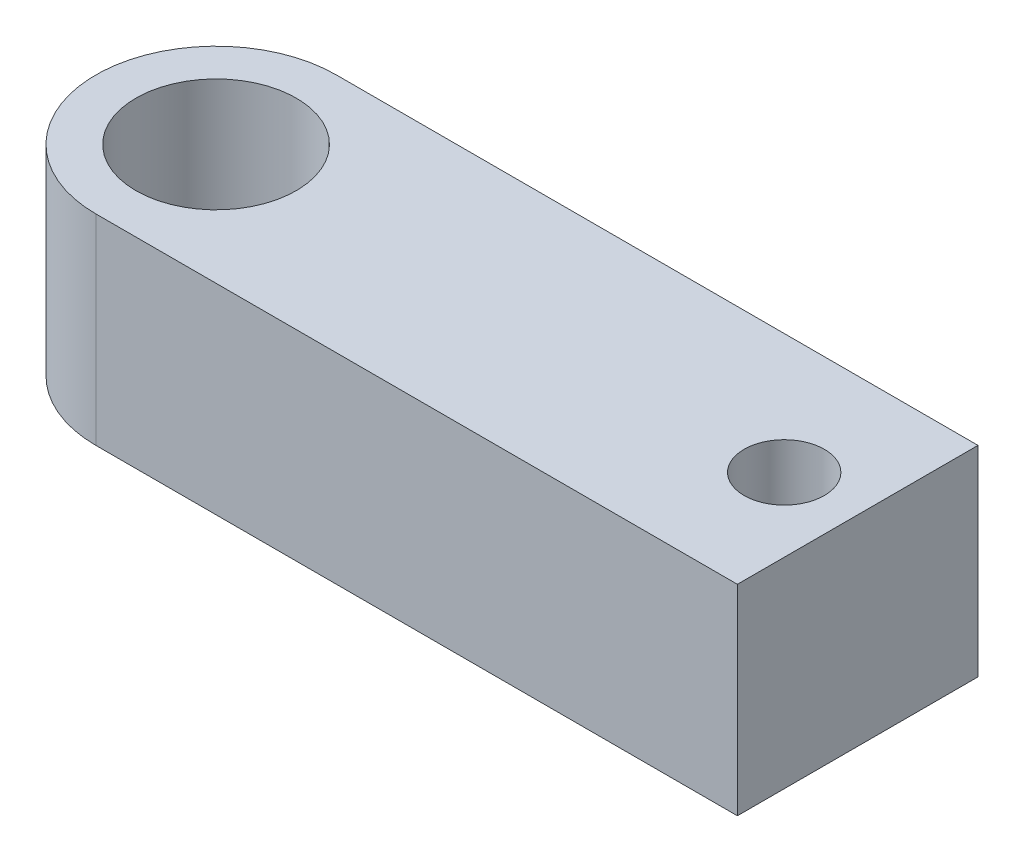
ISO-10303-21;
HEADER;
FILE_DESCRIPTION(('STEP AP214'),'2;1');
FILE_NAME('part.step','',(''),(''),'','','');
FILE_SCHEMA(('AUTOMOTIVE_DESIGN { 1 0 10303 214 1 1 1 1 }'));
ENDSEC;
DATA;
#1=APPLICATION_CONTEXT('core data for automotive mechanical design processes');
#2=APPLICATION_PROTOCOL_DEFINITION('international standard','automotive_design',2000,#1);
#3=PRODUCT_CONTEXT('',#1,'mechanical');
#4=PRODUCT('Part','Part','',(#3));
#5=PRODUCT_RELATED_PRODUCT_CATEGORY('part','',(#4));
#6=PRODUCT_DEFINITION_FORMATION('','',#4);
#7=PRODUCT_DEFINITION_CONTEXT('part definition',#1,'design');
#8=PRODUCT_DEFINITION('design','',#6,#7);
#9=PRODUCT_DEFINITION_SHAPE('','',#8);
#10=(LENGTH_UNIT() NAMED_UNIT(*) SI_UNIT(.MILLI.,.METRE.));
#11=(NAMED_UNIT(*) PLANE_ANGLE_UNIT() SI_UNIT($,.RADIAN.));
#12=(NAMED_UNIT(*) SI_UNIT($,.STERADIAN.) SOLID_ANGLE_UNIT());
#13=UNCERTAINTY_MEASURE_WITH_UNIT(LENGTH_MEASURE(1.E-05),#10,'distance_accuracy_value','');
#14=(GEOMETRIC_REPRESENTATION_CONTEXT(3) GLOBAL_UNCERTAINTY_ASSIGNED_CONTEXT((#13)) GLOBAL_UNIT_ASSIGNED_CONTEXT((#10,
#11,#12)) REPRESENTATION_CONTEXT('',''));
#15=CARTESIAN_POINT('',(0.,0.,0.));
#16=DIRECTION('',(0.,0.,1.));
#17=DIRECTION('',(1.,0.,0.));
#18=AXIS2_PLACEMENT_3D('',#15,#16,#17);
#19=CARTESIAN_POINT('',(0.,5.,0.));
#20=DIRECTION('',(0.,-1.,0.));
#21=DIRECTION('',(0.,0.,-1.));
#22=AXIS2_PLACEMENT_3D('',#19,#20,#21);
#23=CYLINDRICAL_SURFACE('',#22,3.);
#24=CARTESIAN_POINT('',(0.,0.,0.));
#25=DIRECTION('',(0.,1.,0.));
#26=DIRECTION('',(0.,0.,1.));
#27=AXIS2_PLACEMENT_3D('',#24,#25,#26);
#28=CIRCLE('',#27,3.);
#29=CARTESIAN_POINT('',(0.,0.,-3.));
#30=VERTEX_POINT('',#29);
#31=CARTESIAN_POINT('',(0.,0.,3.));
#32=VERTEX_POINT('',#31);
#33=EDGE_CURVE('E98',#30,#32,#28,.T.);
#34=ORIENTED_EDGE('',*,*,#33,.T.);
#35=DIRECTION('',(0.,-1.,0.));
#36=VECTOR('',#35,1.);
#37=CARTESIAN_POINT('',(0.,5.,3.));
#38=LINE('',#37,#36);
#39=CARTESIAN_POINT('',(0.,5.,3.));
#40=VERTEX_POINT('',#39);
#41=EDGE_CURVE('E11',#40,#32,#38,.T.);
#42=ORIENTED_EDGE('',*,*,#41,.F.);
#43=CARTESIAN_POINT('',(0.,5.,0.));
#44=DIRECTION('',(0.,1.,0.));
#45=DIRECTION('',(0.,0.,1.));
#46=AXIS2_PLACEMENT_3D('',#43,#44,#45);
#47=CIRCLE('',#46,3.);
#48=CARTESIAN_POINT('',(0.,5.,-3.));
#49=VERTEX_POINT('',#48);
#50=EDGE_CURVE('E86',#49,#40,#47,.T.);
#51=ORIENTED_EDGE('',*,*,#50,.F.);
#52=DIRECTION('',(0.,-1.,0.));
#53=VECTOR('',#52,1.);
#54=CARTESIAN_POINT('',(0.,5.,-3.));
#55=LINE('',#54,#53);
#56=EDGE_CURVE('E94',#49,#30,#55,.T.);
#57=ORIENTED_EDGE('',*,*,#56,.T.);
#58=EDGE_LOOP('',(#34,#42,#51,#57));
#59=FACE_BOUND('',#58,.T.);
#60=ADVANCED_FACE('F35',(#59),#23,.T.);
#61=CARTESIAN_POINT('',(0.,5.,3.));
#62=DIRECTION('',(0.,0.,-1.));
#63=DIRECTION('',(-1.,0.,0.));
#64=AXIS2_PLACEMENT_3D('',#61,#62,#63);
#65=PLANE('',#64);
#66=DIRECTION('',(1.,0.,0.));
#67=VECTOR('',#66,1.);
#68=CARTESIAN_POINT('',(0.,0.,3.));
#69=LINE('',#68,#67);
#70=CARTESIAN_POINT('',(16.,0.,3.));
#71=VERTEX_POINT('',#70);
#72=EDGE_CURVE('E90',#32,#71,#69,.T.);
#73=ORIENTED_EDGE('',*,*,#72,.T.);
#74=DIRECTION('',(0.,-1.,0.));
#75=VECTOR('',#74,1.);
#76=CARTESIAN_POINT('',(16.,5.,3.));
#77=LINE('',#76,#75);
#78=CARTESIAN_POINT('',(16.,5.,3.));
#79=VERTEX_POINT('',#78);
#80=EDGE_CURVE('E43',#79,#71,#77,.T.);
#81=ORIENTED_EDGE('',*,*,#80,.F.);
#82=DIRECTION('',(1.,0.,0.));
#83=VECTOR('',#82,1.);
#84=CARTESIAN_POINT('',(0.,5.,3.));
#85=LINE('',#84,#83);
#86=EDGE_CURVE('E81',#40,#79,#85,.T.);
#87=ORIENTED_EDGE('',*,*,#86,.F.);
#88=ORIENTED_EDGE('',*,*,#41,.T.);
#89=EDGE_LOOP('',(#73,#81,#87,#88));
#90=FACE_BOUND('',#89,.T.);
#91=ADVANCED_FACE('F89',(#90),#65,.F.);
#92=CARTESIAN_POINT('',(16.,5.,-3.));
#93=DIRECTION('',(-1.,0.,0.));
#94=DIRECTION('',(0.,0.,1.));
#95=AXIS2_PLACEMENT_3D('',#92,#93,#94);
#96=PLANE('',#95);
#97=DIRECTION('',(0.,0.,-1.));
#98=VECTOR('',#97,1.);
#99=CARTESIAN_POINT('',(16.,0.,-3.));
#100=LINE('',#99,#98);
#101=CARTESIAN_POINT('',(16.,0.,-3.));
#102=VERTEX_POINT('',#101);
#103=EDGE_CURVE('E68',#71,#102,#100,.T.);
#104=ORIENTED_EDGE('',*,*,#103,.T.);
#105=DIRECTION('',(0.,-1.,0.));
#106=VECTOR('',#105,1.);
#107=CARTESIAN_POINT('',(16.,5.,-3.));
#108=LINE('',#107,#106);
#109=CARTESIAN_POINT('',(16.,5.,-3.));
#110=VERTEX_POINT('',#109);
#111=EDGE_CURVE('E91',#110,#102,#108,.T.);
#112=ORIENTED_EDGE('',*,*,#111,.F.);
#113=DIRECTION('',(0.,0.,-1.));
#114=VECTOR('',#113,1.);
#115=CARTESIAN_POINT('',(16.,5.,-3.));
#116=LINE('',#115,#114);
#117=EDGE_CURVE('E84',#79,#110,#116,.T.);
#118=ORIENTED_EDGE('',*,*,#117,.F.);
#119=ORIENTED_EDGE('',*,*,#80,.T.);
#120=EDGE_LOOP('',(#104,#112,#118,#119));
#121=FACE_BOUND('',#120,.T.);
#122=ADVANCED_FACE('F92',(#121),#96,.F.);
#123=CARTESIAN_POINT('',(0.,5.,-3.));
#124=DIRECTION('',(0.,0.,1.));
#125=DIRECTION('',(1.,0.,0.));
#126=AXIS2_PLACEMENT_3D('',#123,#124,#125);
#127=PLANE('',#126);
#128=DIRECTION('',(-1.,0.,0.));
#129=VECTOR('',#128,1.);
#130=CARTESIAN_POINT('',(0.,0.,-3.));
#131=LINE('',#130,#129);
#132=EDGE_CURVE('E74',#102,#30,#131,.T.);
#133=ORIENTED_EDGE('',*,*,#132,.T.);
#134=ORIENTED_EDGE('',*,*,#56,.F.);
#135=DIRECTION('',(-1.,0.,0.));
#136=VECTOR('',#135,1.);
#137=CARTESIAN_POINT('',(0.,5.,-3.));
#138=LINE('',#137,#136);
#139=EDGE_CURVE('E51',#110,#49,#138,.T.);
#140=ORIENTED_EDGE('',*,*,#139,.F.);
#141=ORIENTED_EDGE('',*,*,#111,.T.);
#142=EDGE_LOOP('',(#133,#134,#140,#141));
#143=FACE_BOUND('',#142,.T.);
#144=ADVANCED_FACE('F106',(#143),#127,.F.);
#145=CARTESIAN_POINT('',(0.,5.,0.));
#146=DIRECTION('',(0.,1.,0.));
#147=DIRECTION('',(0.,0.,1.));
#148=AXIS2_PLACEMENT_3D('',#145,#146,#147);
#149=PLANE('',#148);
#150=CARTESIAN_POINT('',(14.1676395344647,5.,0.));
#151=DIRECTION('',(0.,1.,0.));
#152=DIRECTION('',(0.,0.,1.));
#153=AXIS2_PLACEMENT_3D('',#150,#151,#152);
#154=CIRCLE('',#153,1.);
#155=CARTESIAN_POINT('',(14.1676395344647,5.,1.));
#156=VERTEX_POINT('',#155);
#157=EDGE_CURVE('E118',#156,#156,#154,.T.);
#158=ORIENTED_EDGE('',*,*,#157,.F.);
#159=EDGE_LOOP('',(#158));
#160=FACE_BOUND('',#159,.T.);
#161=CARTESIAN_POINT('',(0.,5.,0.));
#162=DIRECTION('',(0.,1.,0.));
#163=DIRECTION('',(0.,0.,1.));
#164=AXIS2_PLACEMENT_3D('',#161,#162,#163);
#165=CIRCLE('',#164,2.);
#166=CARTESIAN_POINT('',(0.,5.,2.));
#167=VERTEX_POINT('',#166);
#168=EDGE_CURVE('E112',#167,#167,#165,.T.);
#169=ORIENTED_EDGE('',*,*,#168,.F.);
#170=EDGE_LOOP('',(#169));
#171=FACE_BOUND('',#170,.T.);
#172=ORIENTED_EDGE('',*,*,#50,.T.);
#173=ORIENTED_EDGE('',*,*,#86,.T.);
#174=ORIENTED_EDGE('',*,*,#117,.T.);
#175=ORIENTED_EDGE('',*,*,#139,.T.);
#176=EDGE_LOOP('',(#172,#173,#174,#175));
#177=FACE_BOUND('',#176,.T.);
#178=ADVANCED_FACE('F82',(#160,#171,#177),#149,.T.);
#179=CARTESIAN_POINT('',(0.,0.,0.));
#180=DIRECTION('',(0.,1.,0.));
#181=DIRECTION('',(0.,0.,1.));
#182=AXIS2_PLACEMENT_3D('',#179,#180,#181);
#183=PLANE('',#182);
#184=CARTESIAN_POINT('',(14.1676395344647,0.,0.));
#185=DIRECTION('',(0.,1.,0.));
#186=DIRECTION('',(0.,0.,1.));
#187=AXIS2_PLACEMENT_3D('',#184,#185,#186);
#188=CIRCLE('',#187,1.);
#189=CARTESIAN_POINT('',(14.1676395344647,0.,1.));
#190=VERTEX_POINT('',#189);
#191=EDGE_CURVE('E115',#190,#190,#188,.T.);
#192=ORIENTED_EDGE('',*,*,#191,.T.);
#193=EDGE_LOOP('',(#192));
#194=FACE_BOUND('',#193,.T.);
#195=CARTESIAN_POINT('',(0.,0.,0.));
#196=DIRECTION('',(0.,1.,0.));
#197=DIRECTION('',(0.,0.,1.));
#198=AXIS2_PLACEMENT_3D('',#195,#196,#197);
#199=CIRCLE('',#198,2.);
#200=CARTESIAN_POINT('',(0.,0.,2.));
#201=VERTEX_POINT('',#200);
#202=EDGE_CURVE('E101',#201,#201,#199,.T.);
#203=ORIENTED_EDGE('',*,*,#202,.T.);
#204=EDGE_LOOP('',(#203));
#205=FACE_BOUND('',#204,.T.);
#206=ORIENTED_EDGE('',*,*,#33,.F.);
#207=ORIENTED_EDGE('',*,*,#132,.F.);
#208=ORIENTED_EDGE('',*,*,#103,.F.);
#209=ORIENTED_EDGE('',*,*,#72,.F.);
#210=EDGE_LOOP('',(#206,#207,#208,#209));
#211=FACE_BOUND('',#210,.T.);
#212=ADVANCED_FACE('F109',(#194,#205,#211),#183,.F.);
#213=CARTESIAN_POINT('',(0.,0.,0.));
#214=DIRECTION('',(0.,1.,0.));
#215=DIRECTION('',(0.,0.,1.));
#216=AXIS2_PLACEMENT_3D('',#213,#214,#215);
#217=CYLINDRICAL_SURFACE('',#216,2.);
#218=ORIENTED_EDGE('',*,*,#202,.F.);
#219=EDGE_LOOP('',(#218));
#220=FACE_BOUND('',#219,.T.);
#221=ORIENTED_EDGE('',*,*,#168,.T.);
#222=EDGE_LOOP('',(#221));
#223=FACE_BOUND('',#222,.T.);
#224=ADVANCED_FACE('F129',(#220,#223),#217,.F.);
#225=CARTESIAN_POINT('',(14.1676395344647,0.,0.));
#226=DIRECTION('',(0.,1.,0.));
#227=DIRECTION('',(0.,0.,1.));
#228=AXIS2_PLACEMENT_3D('',#225,#226,#227);
#229=CYLINDRICAL_SURFACE('',#228,1.);
#230=ORIENTED_EDGE('',*,*,#191,.F.);
#231=EDGE_LOOP('',(#230));
#232=FACE_BOUND('',#231,.T.);
#233=ORIENTED_EDGE('',*,*,#157,.T.);
#234=EDGE_LOOP('',(#233));
#235=FACE_BOUND('',#234,.T.);
#236=ADVANCED_FACE('F126',(#232,#235),#229,.F.);
#237=CLOSED_SHELL('',(#60,#91,#122,#144,#178,#212,#224,#236));
#238=MANIFOLD_SOLID_BREP('B2',#237);
#239=ADVANCED_BREP_SHAPE_REPRESENTATION('',(#18,#238),#14);
#240=SHAPE_DEFINITION_REPRESENTATION(#9,#239);
ENDSEC;
END-ISO-10303-21;
